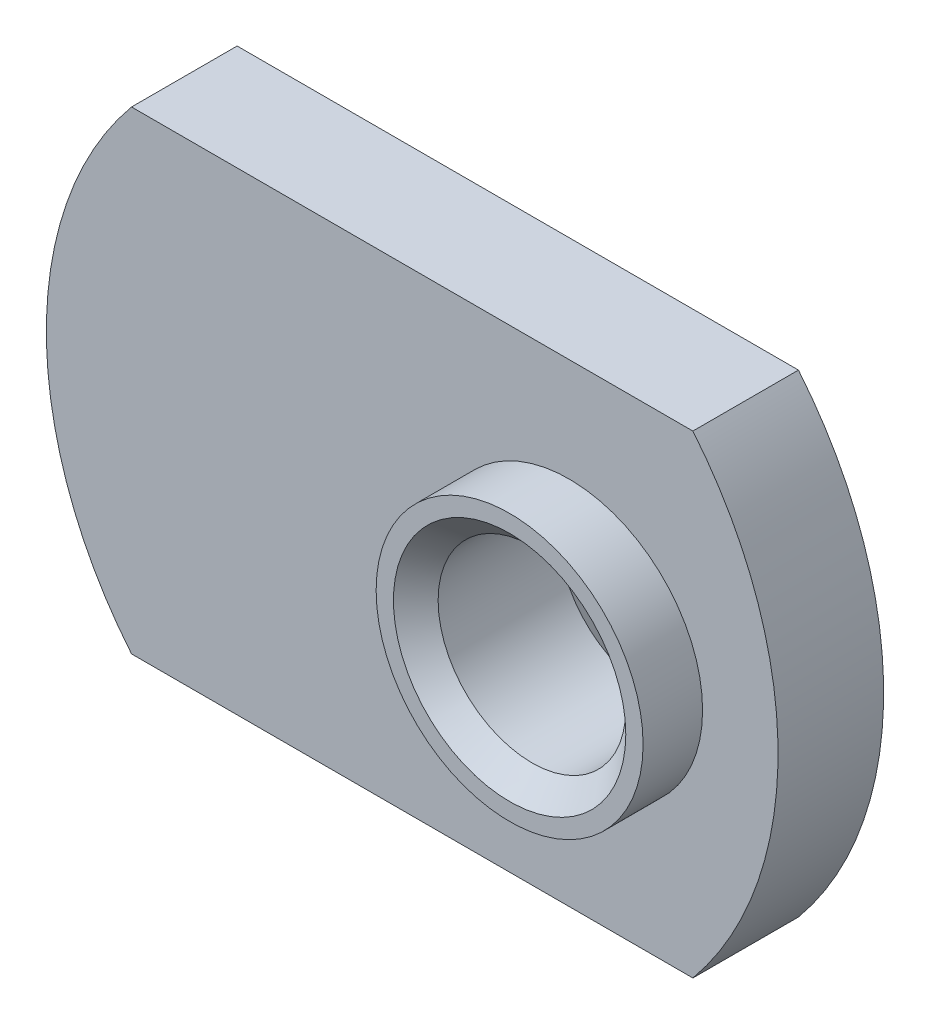
ISO-10303-21;
HEADER;
FILE_DESCRIPTION(('STEP AP214'),'2;1');
FILE_NAME('part.step','',(''),(''),'','','');
FILE_SCHEMA(('AUTOMOTIVE_DESIGN { 1 0 10303 214 1 1 1 1 }'));
ENDSEC;
DATA;
#1=APPLICATION_CONTEXT('core data for automotive mechanical design processes');
#2=APPLICATION_PROTOCOL_DEFINITION('international standard','automotive_design',2000,#1);
#3=PRODUCT_CONTEXT('',#1,'mechanical');
#4=PRODUCT('Part','Part','',(#3));
#5=PRODUCT_RELATED_PRODUCT_CATEGORY('part','',(#4));
#6=PRODUCT_DEFINITION_FORMATION('','',#4);
#7=PRODUCT_DEFINITION_CONTEXT('part definition',#1,'design');
#8=PRODUCT_DEFINITION('design','',#6,#7);
#9=PRODUCT_DEFINITION_SHAPE('','',#8);
#10=(LENGTH_UNIT() NAMED_UNIT(*) SI_UNIT(.MILLI.,.METRE.));
#11=(NAMED_UNIT(*) PLANE_ANGLE_UNIT() SI_UNIT($,.RADIAN.));
#12=(NAMED_UNIT(*) SI_UNIT($,.STERADIAN.) SOLID_ANGLE_UNIT());
#13=UNCERTAINTY_MEASURE_WITH_UNIT(LENGTH_MEASURE(1.E-05),#10,'distance_accuracy_value','');
#14=(GEOMETRIC_REPRESENTATION_CONTEXT(3) GLOBAL_UNCERTAINTY_ASSIGNED_CONTEXT((#13)) GLOBAL_UNIT_ASSIGNED_CONTEXT((#10,
#11,#12)) REPRESENTATION_CONTEXT('',''));
#15=CARTESIAN_POINT('',(0.,0.,0.));
#16=DIRECTION('',(0.,0.,1.));
#17=DIRECTION('',(1.,0.,0.));
#18=AXIS2_PLACEMENT_3D('',#15,#16,#17);
#19=CARTESIAN_POINT('',(-14.9461702752357,8.0899,1.8034));
#20=DIRECTION('',(0.,1.,0.));
#21=DIRECTION('',(1.,0.,0.));
#22=AXIS2_PLACEMENT_3D('',#19,#20,#21);
#23=PLANE('',#22);
#24=DIRECTION('',(-1.,0.,0.));
#25=VECTOR('',#24,1.);
#26=CARTESIAN_POINT('',(4.22737027523567,8.0899,-1.8034));
#27=LINE('',#26,#25);
#28=CARTESIAN_POINT('',(4.22737027523567,8.0899,-1.8034));
#29=VERTEX_POINT('',#28);
#30=CARTESIAN_POINT('',(-14.9461702752357,8.0899,-1.8034));
#31=VERTEX_POINT('',#30);
#32=EDGE_CURVE('E59',#29,#31,#27,.T.);
#33=ORIENTED_EDGE('',*,*,#32,.T.);
#34=DIRECTION('',(0.,0.,1.));
#35=VECTOR('',#34,1.);
#36=CARTESIAN_POINT('',(-14.9461702752357,8.0899,-1.8034));
#37=LINE('',#36,#35);
#38=CARTESIAN_POINT('',(-14.9461702752357,8.0899,1.8034));
#39=VERTEX_POINT('',#38);
#40=EDGE_CURVE('E72',#39,#31,#37,.F.);
#41=ORIENTED_EDGE('',*,*,#40,.F.);
#42=DIRECTION('',(1.,0.,0.));
#43=VECTOR('',#42,1.);
#44=CARTESIAN_POINT('',(-14.9461702752357,8.0899,1.8034));
#45=LINE('',#44,#43);
#46=CARTESIAN_POINT('',(4.22737027523567,8.0899,1.8034));
#47=VERTEX_POINT('',#46);
#48=EDGE_CURVE('E78',#47,#39,#45,.F.);
#49=ORIENTED_EDGE('',*,*,#48,.F.);
#50=DIRECTION('',(0.,0.,-1.));
#51=VECTOR('',#50,1.);
#52=CARTESIAN_POINT('',(4.22737027523567,8.0899,1.8034));
#53=LINE('',#52,#51);
#54=EDGE_CURVE('E66',#47,#29,#53,.T.);
#55=ORIENTED_EDGE('',*,*,#54,.T.);
#56=EDGE_LOOP('',(#33,#41,#49,#55));
#57=FACE_BOUND('',#56,.T.);
#58=ADVANCED_FACE('F16',(#57),#23,.T.);
#59=CARTESIAN_POINT('',(-5.1562000000003,0.,1.8034));
#60=DIRECTION('',(0.,0.,-1.));
#61=DIRECTION('',(-0.770863801199655,-0.637000000000015,0.));
#62=AXIS2_PLACEMENT_3D('',#59,#60,#61);
#63=CYLINDRICAL_SURFACE('',#62,12.6999999999997);
#64=CARTESIAN_POINT('',(-5.1562000000003,0.,-1.8034));
#65=DIRECTION('',(0.,0.,1.));
#66=DIRECTION('',(-0.770863801199654,0.637000000000016,0.));
#67=AXIS2_PLACEMENT_3D('',#64,#65,#66);
#68=CIRCLE('',#67,12.6999999999997);
#69=CARTESIAN_POINT('',(-14.9461702752357,-8.08989999999999,-1.8034));
#70=VERTEX_POINT('',#69);
#71=EDGE_CURVE('E55',#31,#70,#68,.T.);
#72=ORIENTED_EDGE('',*,*,#71,.T.);
#73=DIRECTION('',(0.,0.,1.));
#74=VECTOR('',#73,1.);
#75=CARTESIAN_POINT('',(-14.9461702752357,-8.08989999999999,-1.8034));
#76=LINE('',#75,#74);
#77=CARTESIAN_POINT('',(-14.9461702752357,-8.08989999999999,1.8034));
#78=VERTEX_POINT('',#77);
#79=EDGE_CURVE('E65',#78,#70,#76,.F.);
#80=ORIENTED_EDGE('',*,*,#79,.F.);
#81=CARTESIAN_POINT('',(-5.1562000000003,0.,1.8034));
#82=DIRECTION('',(0.,0.,-1.));
#83=DIRECTION('',(-0.770863801199655,-0.637000000000015,0.));
#84=AXIS2_PLACEMENT_3D('',#81,#82,#83);
#85=CIRCLE('',#84,12.6999999999997);
#86=EDGE_CURVE('E77',#39,#78,#85,.F.);
#87=ORIENTED_EDGE('',*,*,#86,.F.);
#88=ORIENTED_EDGE('',*,*,#40,.T.);
#89=EDGE_LOOP('',(#72,#80,#87,#88));
#90=FACE_BOUND('',#89,.T.);
#91=ADVANCED_FACE('F76',(#90),#63,.T.);
#92=CARTESIAN_POINT('',(-14.9461702752357,-8.0899,-1.8034));
#93=DIRECTION('',(0.,-1.,0.));
#94=DIRECTION('',(1.,0.,0.));
#95=AXIS2_PLACEMENT_3D('',#92,#93,#94);
#96=PLANE('',#95);
#97=DIRECTION('',(1.,0.,0.));
#98=VECTOR('',#97,1.);
#99=CARTESIAN_POINT('',(-14.9461702752357,-8.0899,-1.8034));
#100=LINE('',#99,#98);
#101=CARTESIAN_POINT('',(4.22737027523568,-8.0899,-1.8034));
#102=VERTEX_POINT('',#101);
#103=EDGE_CURVE('E60',#70,#102,#100,.T.);
#104=ORIENTED_EDGE('',*,*,#103,.T.);
#105=DIRECTION('',(0.,0.,1.));
#106=VECTOR('',#105,1.);
#107=CARTESIAN_POINT('',(4.22737027523568,-8.0899,-1.8034));
#108=LINE('',#107,#106);
#109=CARTESIAN_POINT('',(4.22737027523568,-8.0899,1.8034));
#110=VERTEX_POINT('',#109);
#111=EDGE_CURVE('E100',#110,#102,#108,.F.);
#112=ORIENTED_EDGE('',*,*,#111,.F.);
#113=DIRECTION('',(-1.,0.,0.));
#114=VECTOR('',#113,1.);
#115=CARTESIAN_POINT('',(4.22737027523568,-8.0899,1.8034));
#116=LINE('',#115,#114);
#117=EDGE_CURVE('E31',#78,#110,#116,.F.);
#118=ORIENTED_EDGE('',*,*,#117,.F.);
#119=ORIENTED_EDGE('',*,*,#79,.T.);
#120=EDGE_LOOP('',(#104,#112,#118,#119));
#121=FACE_BOUND('',#120,.T.);
#122=ADVANCED_FACE('F150',(#121),#96,.T.);
#123=CARTESIAN_POINT('',(-5.56259999999969,0.,1.8034));
#124=DIRECTION('',(0.,0.,-1.));
#125=DIRECTION('',(0.770863801199654,0.637000000000016,0.));
#126=AXIS2_PLACEMENT_3D('',#123,#124,#125);
#127=CYLINDRICAL_SURFACE('',#126,12.6999999999997);
#128=CARTESIAN_POINT('',(-5.56259999999969,0.,-1.8034));
#129=DIRECTION('',(0.,0.,1.));
#130=DIRECTION('',(0.770863801199654,-0.637000000000016,0.));
#131=AXIS2_PLACEMENT_3D('',#128,#129,#130);
#132=CIRCLE('',#131,12.6999999999997);
#133=EDGE_CURVE('E39',#102,#29,#132,.T.);
#134=ORIENTED_EDGE('',*,*,#133,.T.);
#135=ORIENTED_EDGE('',*,*,#54,.F.);
#136=CARTESIAN_POINT('',(-5.56259999999969,0.,1.8034));
#137=DIRECTION('',(0.,0.,-1.));
#138=DIRECTION('',(0.770863801199654,0.637000000000016,0.));
#139=AXIS2_PLACEMENT_3D('',#136,#137,#138);
#140=CIRCLE('',#139,12.6999999999997);
#141=EDGE_CURVE('E111',#110,#47,#140,.F.);
#142=ORIENTED_EDGE('',*,*,#141,.F.);
#143=ORIENTED_EDGE('',*,*,#111,.T.);
#144=EDGE_LOOP('',(#134,#135,#142,#143));
#145=FACE_BOUND('',#144,.T.);
#146=ADVANCED_FACE('F155',(#145),#127,.T.);
#147=CARTESIAN_POINT('',(-18.0264403146215,-8.08990000000001,1.8034));
#148=DIRECTION('',(0.,0.,1.));
#149=DIRECTION('',(1.,0.,0.));
#150=AXIS2_PLACEMENT_3D('',#147,#148,#149);
#151=PLANE('',#150);
#152=ORIENTED_EDGE('',*,*,#48,.T.);
#153=ORIENTED_EDGE('',*,*,#86,.T.);
#154=ORIENTED_EDGE('',*,*,#117,.T.);
#155=ORIENTED_EDGE('',*,*,#141,.T.);
#156=EDGE_LOOP('',(#152,#153,#154,#155));
#157=FACE_BOUND('',#156,.T.);
#158=CARTESIAN_POINT('',(0.,0.,1.8034));
#159=DIRECTION('',(0.,0.,-1.));
#160=DIRECTION('',(0.99999999999999,-1.42053904104465E-07,0.));
#161=AXIS2_PLACEMENT_3D('',#158,#159,#160);
#162=CIRCLE('',#161,4.5593);
#163=CARTESIAN_POINT('',(4.55929999999995,-6.47666364983488E-07,1.8034));
#164=VERTEX_POINT('',#163);
#165=EDGE_CURVE('E115',#164,#164,#162,.T.);
#166=ORIENTED_EDGE('',*,*,#165,.T.);
#167=EDGE_LOOP('',(#166));
#168=FACE_BOUND('',#167,.T.);
#169=ADVANCED_FACE('F159',(#157,#168),#151,.T.);
#170=CARTESIAN_POINT('',(-18.0264403146215,-8.08990000000001,-1.8034));
#171=DIRECTION('',(0.,0.,-1.));
#172=DIRECTION('',(0.,1.,0.));
#173=AXIS2_PLACEMENT_3D('',#170,#171,#172);
#174=PLANE('',#173);
#175=ORIENTED_EDGE('',*,*,#32,.F.);
#176=ORIENTED_EDGE('',*,*,#133,.F.);
#177=ORIENTED_EDGE('',*,*,#103,.F.);
#178=ORIENTED_EDGE('',*,*,#71,.F.);
#179=EDGE_LOOP('',(#175,#176,#177,#178));
#180=FACE_BOUND('',#179,.T.);
#181=CARTESIAN_POINT('',(0.,0.,-1.8034));
#182=DIRECTION('',(0.,0.,1.));
#183=DIRECTION('',(-1.,0.,0.));
#184=AXIS2_PLACEMENT_3D('',#181,#182,#183);
#185=CIRCLE('',#184,3.96875);
#186=CARTESIAN_POINT('',(-3.96875,0.,-1.8034));
#187=VERTEX_POINT('',#186);
#188=EDGE_CURVE('E120',#187,#187,#185,.F.);
#189=ORIENTED_EDGE('',*,*,#188,.F.);
#190=EDGE_LOOP('',(#189));
#191=FACE_BOUND('',#190,.T.);
#192=ADVANCED_FACE('F57',(#180,#191),#174,.T.);
#193=CARTESIAN_POINT('',(-4.55930035005765,-4.5592997790664,3.8354));
#194=DIRECTION('',(0.,0.,1.));
#195=DIRECTION('',(1.,0.,0.));
#196=AXIS2_PLACEMENT_3D('',#193,#194,#195);
#197=PLANE('',#196);
#198=CARTESIAN_POINT('',(0.,0.,3.8354));
#199=DIRECTION('',(0.,0.,1.));
#200=DIRECTION('',(-0.99999999999999,-1.42067208371604E-07,0.));
#201=AXIS2_PLACEMENT_3D('',#198,#199,#200);
#202=CIRCLE('',#201,4.5593);
#203=CARTESIAN_POINT('',(-4.55929999999995,-6.47727023128656E-07,3.8354));
#204=VERTEX_POINT('',#203);
#205=EDGE_CURVE('E123',#204,#204,#202,.T.);
#206=ORIENTED_EDGE('',*,*,#205,.T.);
#207=EDGE_LOOP('',(#206));
#208=FACE_BOUND('',#207,.T.);
#209=CARTESIAN_POINT('',(0.,0.,3.8354));
#210=DIRECTION('',(0.,0.,-1.));
#211=DIRECTION('',(1.,0.,0.));
#212=AXIS2_PLACEMENT_3D('',#209,#210,#211);
#213=CIRCLE('',#212,3.96875);
#214=CARTESIAN_POINT('',(3.96875,0.,3.8354));
#215=VERTEX_POINT('',#214);
#216=EDGE_CURVE('E126',#215,#215,#213,.T.);
#217=ORIENTED_EDGE('',*,*,#216,.T.);
#218=EDGE_LOOP('',(#217));
#219=FACE_BOUND('',#218,.T.);
#220=ADVANCED_FACE('F165',(#208,#219),#197,.T.);
#221=CARTESIAN_POINT('',(0.,0.,3.8354));
#222=DIRECTION('',(0.,0.,-1.));
#223=DIRECTION('',(1.,0.,0.));
#224=AXIS2_PLACEMENT_3D('',#221,#222,#223);
#225=CYLINDRICAL_SURFACE('',#224,4.5593);
#226=ORIENTED_EDGE('',*,*,#165,.F.);
#227=EDGE_LOOP('',(#226));
#228=FACE_BOUND('',#227,.T.);
#229=ORIENTED_EDGE('',*,*,#205,.F.);
#230=EDGE_LOOP('',(#229));
#231=FACE_BOUND('',#230,.T.);
#232=ADVANCED_FACE('F142',(#228,#231),#225,.T.);
#233=CARTESIAN_POINT('',(0.,0.,3.8354));
#234=DIRECTION('',(0.,0.,1.));
#235=DIRECTION('',(-1.,0.,0.));
#236=AXIS2_PLACEMENT_3D('',#233,#234,#235);
#237=CONICAL_SURFACE('',#236,3.96875,0.785398163397447);
#238=ORIENTED_EDGE('',*,*,#216,.F.);
#239=EDGE_LOOP('',(#238));
#240=FACE_BOUND('',#239,.T.);
#241=CARTESIAN_POINT('',(0.,0.,3.07213));
#242=DIRECTION('',(0.,0.,-1.));
#243=DIRECTION('',(1.,0.,0.));
#244=AXIS2_PLACEMENT_3D('',#241,#242,#243);
#245=CIRCLE('',#244,3.20548);
#246=CARTESIAN_POINT('',(3.20548,0.,3.07213));
#247=VERTEX_POINT('',#246);
#248=EDGE_CURVE('E24',#247,#247,#245,.T.);
#249=ORIENTED_EDGE('',*,*,#248,.T.);
#250=EDGE_LOOP('',(#249));
#251=FACE_BOUND('',#250,.T.);
#252=ADVANCED_FACE('F131',(#240,#251),#237,.F.);
#253=CARTESIAN_POINT('',(0.,0.,-1.8034));
#254=DIRECTION('',(0.,0.,-1.));
#255=DIRECTION('',(1.,0.,0.));
#256=AXIS2_PLACEMENT_3D('',#253,#254,#255);
#257=CYLINDRICAL_SURFACE('',#256,3.20548);
#258=CARTESIAN_POINT('',(0.,0.,-1.04013));
#259=DIRECTION('',(0.,0.,-1.));
#260=DIRECTION('',(1.,0.,0.));
#261=AXIS2_PLACEMENT_3D('',#258,#259,#260);
#262=CIRCLE('',#261,3.20548);
#263=CARTESIAN_POINT('',(3.20548,0.,-1.04013));
#264=VERTEX_POINT('',#263);
#265=EDGE_CURVE('E10',#264,#264,#262,.T.);
#266=ORIENTED_EDGE('',*,*,#265,.T.);
#267=EDGE_LOOP('',(#266));
#268=FACE_BOUND('',#267,.T.);
#269=ORIENTED_EDGE('',*,*,#248,.F.);
#270=EDGE_LOOP('',(#269));
#271=FACE_BOUND('',#270,.T.);
#272=ADVANCED_FACE('F133',(#268,#271),#257,.F.);
#273=CARTESIAN_POINT('',(0.,0.,-1.8034));
#274=DIRECTION('',(0.,0.,-1.));
#275=DIRECTION('',(1.,0.,0.));
#276=AXIS2_PLACEMENT_3D('',#273,#274,#275);
#277=CONICAL_SURFACE('',#276,3.96875,0.785398163397448);
#278=ORIENTED_EDGE('',*,*,#188,.T.);
#279=EDGE_LOOP('',(#278));
#280=FACE_BOUND('',#279,.T.);
#281=ORIENTED_EDGE('',*,*,#265,.F.);
#282=EDGE_LOOP('',(#281));
#283=FACE_BOUND('',#282,.T.);
#284=ADVANCED_FACE('F18',(#280,#283),#277,.F.);
#285=CLOSED_SHELL('',(#58,#91,#122,#146,#169,#192,#220,#232,#252,#272,#284));
#286=MANIFOLD_SOLID_BREP('B1',#285);
#287=ADVANCED_BREP_SHAPE_REPRESENTATION('',(#18,#286),#14);
#288=SHAPE_DEFINITION_REPRESENTATION(#9,#287);
ENDSEC;
END-ISO-10303-21;
